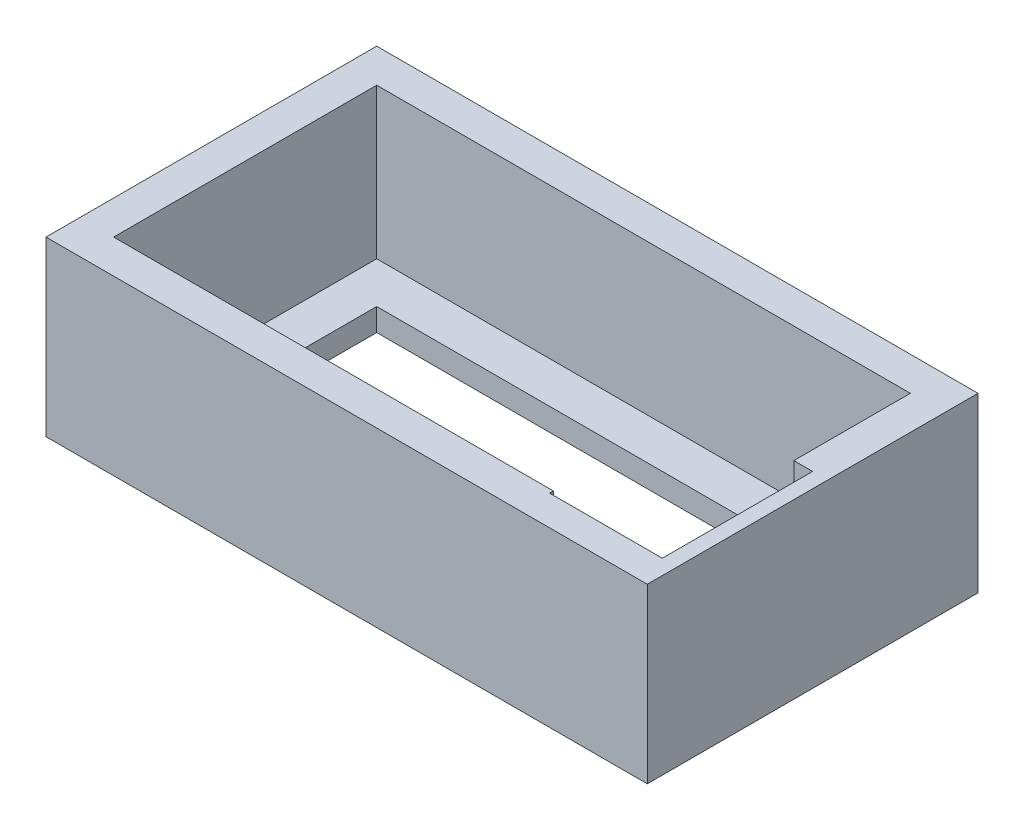
ISO-10303-21;
HEADER;
FILE_DESCRIPTION(('STEP AP214'),'2;1');
FILE_NAME('part.step','',(''),(''),'','','');
FILE_SCHEMA(('AUTOMOTIVE_DESIGN { 1 0 10303 214 1 1 1 1 }'));
ENDSEC;
DATA;
#1=APPLICATION_CONTEXT('core data for automotive mechanical design processes');
#2=APPLICATION_PROTOCOL_DEFINITION('international standard','automotive_design',2000,#1);
#3=PRODUCT_CONTEXT('',#1,'mechanical');
#4=PRODUCT('Part','Part','',(#3));
#5=PRODUCT_RELATED_PRODUCT_CATEGORY('part','',(#4));
#6=PRODUCT_DEFINITION_FORMATION('','',#4);
#7=PRODUCT_DEFINITION_CONTEXT('part definition',#1,'design');
#8=PRODUCT_DEFINITION('design','',#6,#7);
#9=PRODUCT_DEFINITION_SHAPE('','',#8);
#10=(LENGTH_UNIT() NAMED_UNIT(*) SI_UNIT(.MILLI.,.METRE.));
#11=(NAMED_UNIT(*) PLANE_ANGLE_UNIT() SI_UNIT($,.RADIAN.));
#12=(NAMED_UNIT(*) SI_UNIT($,.STERADIAN.) SOLID_ANGLE_UNIT());
#13=UNCERTAINTY_MEASURE_WITH_UNIT(LENGTH_MEASURE(1.E-05),#10,'distance_accuracy_value','');
#14=(GEOMETRIC_REPRESENTATION_CONTEXT(3) GLOBAL_UNCERTAINTY_ASSIGNED_CONTEXT((#13)) GLOBAL_UNIT_ASSIGNED_CONTEXT((#10,
#11,#12)) REPRESENTATION_CONTEXT('',''));
#15=CARTESIAN_POINT('',(0.,0.,0.));
#16=DIRECTION('',(0.,0.,1.));
#17=DIRECTION('',(1.,0.,0.));
#18=AXIS2_PLACEMENT_3D('',#15,#16,#17);
#19=CARTESIAN_POINT('',(0.,3.,0.));
#20=DIRECTION('',(0.,-1.,0.));
#21=DIRECTION('',(0.,0.,-1.));
#22=AXIS2_PLACEMENT_3D('',#19,#20,#21);
#23=PLANE('',#22);
#24=DIRECTION('',(0.,0.,-1.));
#25=VECTOR('',#24,1.);
#26=CARTESIAN_POINT('',(30.,3.,12.));
#27=LINE('',#26,#25);
#28=CARTESIAN_POINT('',(30.,3.,-2.));
#29=VERTEX_POINT('',#28);
#30=CARTESIAN_POINT('',(30.,3.,-12.));
#31=VERTEX_POINT('',#30);
#32=EDGE_CURVE('E56',#29,#31,#27,.T.);
#33=ORIENTED_EDGE('',*,*,#32,.F.);
#34=DIRECTION('',(-1.,0.,0.));
#35=VECTOR('',#34,1.);
#36=CARTESIAN_POINT('',(38.,3.,-2.));
#37=LINE('',#36,#35);
#38=CARTESIAN_POINT('',(35.5,3.,-2.));
#39=VERTEX_POINT('',#38);
#40=EDGE_CURVE('E175',#39,#29,#37,.T.);
#41=ORIENTED_EDGE('',*,*,#40,.F.);
#42=DIRECTION('',(0.,0.,-1.));
#43=VECTOR('',#42,1.);
#44=CARTESIAN_POINT('',(35.5,3.,17.5));
#45=LINE('',#44,#43);
#46=CARTESIAN_POINT('',(35.5,3.,-17.5));
#47=VERTEX_POINT('',#46);
#48=EDGE_CURVE('E195',#39,#47,#45,.T.);
#49=ORIENTED_EDGE('',*,*,#48,.T.);
#50=DIRECTION('',(-1.,0.,0.));
#51=VECTOR('',#50,1.);
#52=CARTESIAN_POINT('',(35.5,3.,-17.5));
#53=LINE('',#52,#51);
#54=CARTESIAN_POINT('',(-35.5,3.,-17.5));
#55=VERTEX_POINT('',#54);
#56=EDGE_CURVE('E209',#47,#55,#53,.T.);
#57=ORIENTED_EDGE('',*,*,#56,.T.);
#58=DIRECTION('',(0.,0.,1.));
#59=VECTOR('',#58,1.);
#60=CARTESIAN_POINT('',(-35.5,3.,-17.5));
#61=LINE('',#60,#59);
#62=CARTESIAN_POINT('',(-35.5,3.,17.5));
#63=VERTEX_POINT('',#62);
#64=EDGE_CURVE('E212',#55,#63,#61,.T.);
#65=ORIENTED_EDGE('',*,*,#64,.T.);
#66=DIRECTION('',(1.,0.,0.));
#67=VECTOR('',#66,1.);
#68=CARTESIAN_POINT('',(-35.5,3.,17.5));
#69=LINE('',#68,#67);
#70=CARTESIAN_POINT('',(23.,3.,17.5));
#71=VERTEX_POINT('',#70);
#72=EDGE_CURVE('E199',#63,#71,#69,.T.);
#73=ORIENTED_EDGE('',*,*,#72,.T.);
#74=DIRECTION('',(0.,0.,1.));
#75=VECTOR('',#74,1.);
#76=CARTESIAN_POINT('',(23.,3.,18.));
#77=LINE('',#76,#75);
#78=CARTESIAN_POINT('',(23.,3.,12.));
#79=VERTEX_POINT('',#78);
#80=EDGE_CURVE('E48',#79,#71,#77,.T.);
#81=ORIENTED_EDGE('',*,*,#80,.F.);
#82=DIRECTION('',(1.,0.,0.));
#83=VECTOR('',#82,1.);
#84=CARTESIAN_POINT('',(-30.,3.,12.));
#85=LINE('',#84,#83);
#86=CARTESIAN_POINT('',(-30.,3.,12.));
#87=VERTEX_POINT('',#86);
#88=EDGE_CURVE('E238',#87,#79,#85,.T.);
#89=ORIENTED_EDGE('',*,*,#88,.F.);
#90=DIRECTION('',(0.,0.,1.));
#91=VECTOR('',#90,1.);
#92=CARTESIAN_POINT('',(-30.,3.,12.));
#93=LINE('',#92,#91);
#94=CARTESIAN_POINT('',(-30.,3.,-12.));
#95=VERTEX_POINT('',#94);
#96=EDGE_CURVE('E236',#95,#87,#93,.T.);
#97=ORIENTED_EDGE('',*,*,#96,.F.);
#98=DIRECTION('',(-1.,0.,0.));
#99=VECTOR('',#98,1.);
#100=CARTESIAN_POINT('',(-30.,3.,-12.));
#101=LINE('',#100,#99);
#102=EDGE_CURVE('E243',#31,#95,#101,.T.);
#103=ORIENTED_EDGE('',*,*,#102,.F.);
#104=EDGE_LOOP('',(#33,#41,#49,#57,#65,#73,#81,#89,#97,#103));
#105=FACE_BOUND('',#104,.T.);
#106=ADVANCED_FACE('F33',(#105),#23,.F.);
#107=CARTESIAN_POINT('',(0.,0.,0.));
#108=DIRECTION('',(0.,-1.,0.));
#109=DIRECTION('',(0.,0.,-1.));
#110=AXIS2_PLACEMENT_3D('',#107,#108,#109);
#111=PLANE('',#110);
#112=DIRECTION('',(1.,0.,0.));
#113=VECTOR('',#112,1.);
#114=CARTESIAN_POINT('',(38.,0.,-2.));
#115=LINE('',#114,#113);
#116=CARTESIAN_POINT('',(30.,0.,-2.));
#117=VERTEX_POINT('',#116);
#118=CARTESIAN_POINT('',(38.,0.,-2.));
#119=VERTEX_POINT('',#118);
#120=EDGE_CURVE('E166',#117,#119,#115,.T.);
#121=ORIENTED_EDGE('',*,*,#120,.F.);
#122=DIRECTION('',(0.,0.,-1.));
#123=VECTOR('',#122,1.);
#124=CARTESIAN_POINT('',(30.,0.,12.));
#125=LINE('',#124,#123);
#126=CARTESIAN_POINT('',(30.,0.,-12.));
#127=VERTEX_POINT('',#126);
#128=EDGE_CURVE('E250',#117,#127,#125,.T.);
#129=ORIENTED_EDGE('',*,*,#128,.T.);
#130=DIRECTION('',(-1.,0.,0.));
#131=VECTOR('',#130,1.);
#132=CARTESIAN_POINT('',(-30.,0.,-12.));
#133=LINE('',#132,#131);
#134=CARTESIAN_POINT('',(-30.,0.,-12.));
#135=VERTEX_POINT('',#134);
#136=EDGE_CURVE('E239',#127,#135,#133,.T.);
#137=ORIENTED_EDGE('',*,*,#136,.T.);
#138=DIRECTION('',(0.,0.,1.));
#139=VECTOR('',#138,1.);
#140=CARTESIAN_POINT('',(-30.,0.,12.));
#141=LINE('',#140,#139);
#142=CARTESIAN_POINT('',(-30.,0.,12.));
#143=VERTEX_POINT('',#142);
#144=EDGE_CURVE('E235',#135,#143,#141,.T.);
#145=ORIENTED_EDGE('',*,*,#144,.T.);
#146=DIRECTION('',(1.,0.,0.));
#147=VECTOR('',#146,1.);
#148=CARTESIAN_POINT('',(-30.,0.,12.));
#149=LINE('',#148,#147);
#150=CARTESIAN_POINT('',(23.,0.,12.));
#151=VERTEX_POINT('',#150);
#152=EDGE_CURVE('E248',#143,#151,#149,.T.);
#153=ORIENTED_EDGE('',*,*,#152,.T.);
#154=DIRECTION('',(0.,0.,-1.));
#155=VECTOR('',#154,1.);
#156=CARTESIAN_POINT('',(23.,0.,18.));
#157=LINE('',#156,#155);
#158=CARTESIAN_POINT('',(23.,0.,18.));
#159=VERTEX_POINT('',#158);
#160=EDGE_CURVE('E180',#159,#151,#157,.T.);
#161=ORIENTED_EDGE('',*,*,#160,.F.);
#162=DIRECTION('',(-1.,0.,0.));
#163=VECTOR('',#162,1.);
#164=CARTESIAN_POINT('',(38.,0.,18.));
#165=LINE('',#164,#163);
#166=CARTESIAN_POINT('',(38.,0.,18.));
#167=VERTEX_POINT('',#166);
#168=EDGE_CURVE('E158',#167,#159,#165,.T.);
#169=ORIENTED_EDGE('',*,*,#168,.F.);
#170=DIRECTION('',(0.,0.,1.));
#171=VECTOR('',#170,1.);
#172=CARTESIAN_POINT('',(38.,0.,18.));
#173=LINE('',#172,#171);
#174=EDGE_CURVE('E169',#119,#167,#173,.T.);
#175=ORIENTED_EDGE('',*,*,#174,.F.);
#176=EDGE_LOOP('',(#121,#129,#137,#145,#153,#161,#169,#175));
#177=FACE_BOUND('',#176,.T.);
#178=DIRECTION('',(0.,0.,-1.));
#179=VECTOR('',#178,1.);
#180=CARTESIAN_POINT('',(40.,0.,22.));
#181=LINE('',#180,#179);
#182=CARTESIAN_POINT('',(40.,0.,22.));
#183=VERTEX_POINT('',#182);
#184=CARTESIAN_POINT('',(40.,0.,-22.));
#185=VERTEX_POINT('',#184);
#186=EDGE_CURVE('E261',#183,#185,#181,.T.);
#187=ORIENTED_EDGE('',*,*,#186,.F.);
#188=DIRECTION('',(1.,0.,0.));
#189=VECTOR('',#188,1.);
#190=CARTESIAN_POINT('',(-40.,0.,22.));
#191=LINE('',#190,#189);
#192=CARTESIAN_POINT('',(-40.,0.,22.));
#193=VERTEX_POINT('',#192);
#194=EDGE_CURVE('E268',#193,#183,#191,.T.);
#195=ORIENTED_EDGE('',*,*,#194,.F.);
#196=DIRECTION('',(0.,0.,1.));
#197=VECTOR('',#196,1.);
#198=CARTESIAN_POINT('',(-40.,0.,22.));
#199=LINE('',#198,#197);
#200=CARTESIAN_POINT('',(-40.,0.,-22.));
#201=VERTEX_POINT('',#200);
#202=EDGE_CURVE('E266',#201,#193,#199,.T.);
#203=ORIENTED_EDGE('',*,*,#202,.F.);
#204=DIRECTION('',(-1.,0.,0.));
#205=VECTOR('',#204,1.);
#206=CARTESIAN_POINT('',(-40.,0.,-22.));
#207=LINE('',#206,#205);
#208=EDGE_CURVE('E264',#185,#201,#207,.T.);
#209=ORIENTED_EDGE('',*,*,#208,.F.);
#210=EDGE_LOOP('',(#187,#195,#203,#209));
#211=FACE_BOUND('',#210,.T.);
#212=ADVANCED_FACE('F177',(#177,#211),#111,.T.);
#213=CARTESIAN_POINT('',(40.,3.,22.));
#214=DIRECTION('',(-1.,0.,0.));
#215=DIRECTION('',(0.,0.,1.));
#216=AXIS2_PLACEMENT_3D('',#213,#214,#215);
#217=PLANE('',#216);
#218=ORIENTED_EDGE('',*,*,#186,.T.);
#219=DIRECTION('',(0.,-1.,0.));
#220=VECTOR('',#219,1.);
#221=CARTESIAN_POINT('',(40.,3.,-22.));
#222=LINE('',#221,#220);
#223=CARTESIAN_POINT('',(40.,23.,-22.));
#224=VERTEX_POINT('',#223);
#225=EDGE_CURVE('E11',#224,#185,#222,.T.);
#226=ORIENTED_EDGE('',*,*,#225,.F.);
#227=DIRECTION('',(0.,0.,-1.));
#228=VECTOR('',#227,1.);
#229=CARTESIAN_POINT('',(40.,23.,22.));
#230=LINE('',#229,#228);
#231=CARTESIAN_POINT('',(40.,23.,22.));
#232=VERTEX_POINT('',#231);
#233=EDGE_CURVE('E232',#232,#224,#230,.T.);
#234=ORIENTED_EDGE('',*,*,#233,.F.);
#235=DIRECTION('',(0.,-1.,0.));
#236=VECTOR('',#235,1.);
#237=CARTESIAN_POINT('',(40.,3.,22.));
#238=LINE('',#237,#236);
#239=EDGE_CURVE('E270',#232,#183,#238,.T.);
#240=ORIENTED_EDGE('',*,*,#239,.T.);
#241=EDGE_LOOP('',(#218,#226,#234,#240));
#242=FACE_BOUND('',#241,.T.);
#243=ADVANCED_FACE('F35',(#242),#217,.F.);
#244=CARTESIAN_POINT('',(-40.,3.,-22.));
#245=DIRECTION('',(0.,0.,1.));
#246=DIRECTION('',(1.,0.,0.));
#247=AXIS2_PLACEMENT_3D('',#244,#245,#246);
#248=PLANE('',#247);
#249=ORIENTED_EDGE('',*,*,#208,.T.);
#250=DIRECTION('',(0.,-1.,0.));
#251=VECTOR('',#250,1.);
#252=CARTESIAN_POINT('',(-40.,3.,-22.));
#253=LINE('',#252,#251);
#254=CARTESIAN_POINT('',(-40.,23.,-22.));
#255=VERTEX_POINT('',#254);
#256=EDGE_CURVE('E41',#255,#201,#253,.T.);
#257=ORIENTED_EDGE('',*,*,#256,.F.);
#258=DIRECTION('',(-1.,0.,0.));
#259=VECTOR('',#258,1.);
#260=CARTESIAN_POINT('',(40.,23.,-22.));
#261=LINE('',#260,#259);
#262=EDGE_CURVE('E223',#224,#255,#261,.T.);
#263=ORIENTED_EDGE('',*,*,#262,.F.);
#264=ORIENTED_EDGE('',*,*,#225,.T.);
#265=EDGE_LOOP('',(#249,#257,#263,#264));
#266=FACE_BOUND('',#265,.T.);
#267=ADVANCED_FACE('F291',(#266),#248,.F.);
#268=CARTESIAN_POINT('',(-40.,3.,22.));
#269=DIRECTION('',(1.,0.,0.));
#270=DIRECTION('',(0.,0.,-1.));
#271=AXIS2_PLACEMENT_3D('',#268,#269,#270);
#272=PLANE('',#271);
#273=ORIENTED_EDGE('',*,*,#202,.T.);
#274=DIRECTION('',(0.,-1.,0.));
#275=VECTOR('',#274,1.);
#276=CARTESIAN_POINT('',(-40.,3.,22.));
#277=LINE('',#276,#275);
#278=CARTESIAN_POINT('',(-40.,23.,22.));
#279=VERTEX_POINT('',#278);
#280=EDGE_CURVE('E273',#279,#193,#277,.T.);
#281=ORIENTED_EDGE('',*,*,#280,.F.);
#282=DIRECTION('',(0.,0.,1.));
#283=VECTOR('',#282,1.);
#284=CARTESIAN_POINT('',(-40.,23.,-22.));
#285=LINE('',#284,#283);
#286=EDGE_CURVE('E226',#255,#279,#285,.T.);
#287=ORIENTED_EDGE('',*,*,#286,.F.);
#288=ORIENTED_EDGE('',*,*,#256,.T.);
#289=EDGE_LOOP('',(#273,#281,#287,#288));
#290=FACE_BOUND('',#289,.T.);
#291=ADVANCED_FACE('F279',(#290),#272,.F.);
#292=CARTESIAN_POINT('',(-40.,3.,22.));
#293=DIRECTION('',(0.,0.,-1.));
#294=DIRECTION('',(-1.,0.,0.));
#295=AXIS2_PLACEMENT_3D('',#292,#293,#294);
#296=PLANE('',#295);
#297=ORIENTED_EDGE('',*,*,#194,.T.);
#298=ORIENTED_EDGE('',*,*,#239,.F.);
#299=DIRECTION('',(1.,0.,0.));
#300=VECTOR('',#299,1.);
#301=CARTESIAN_POINT('',(-40.,23.,22.));
#302=LINE('',#301,#300);
#303=EDGE_CURVE('E229',#279,#232,#302,.T.);
#304=ORIENTED_EDGE('',*,*,#303,.F.);
#305=ORIENTED_EDGE('',*,*,#280,.T.);
#306=EDGE_LOOP('',(#297,#298,#304,#305));
#307=FACE_BOUND('',#306,.T.);
#308=ADVANCED_FACE('F285',(#307),#296,.F.);
#309=CARTESIAN_POINT('',(-30.,3.,12.));
#310=DIRECTION('',(1.,0.,0.));
#311=DIRECTION('',(0.,0.,-1.));
#312=AXIS2_PLACEMENT_3D('',#309,#310,#311);
#313=PLANE('',#312);
#314=ORIENTED_EDGE('',*,*,#144,.F.);
#315=DIRECTION('',(0.,-1.,0.));
#316=VECTOR('',#315,1.);
#317=CARTESIAN_POINT('',(-30.,3.,-12.));
#318=LINE('',#317,#316);
#319=EDGE_CURVE('E245',#95,#135,#318,.T.);
#320=ORIENTED_EDGE('',*,*,#319,.F.);
#321=ORIENTED_EDGE('',*,*,#96,.T.);
#322=DIRECTION('',(0.,-1.,0.));
#323=VECTOR('',#322,1.);
#324=CARTESIAN_POINT('',(-30.,3.,12.));
#325=LINE('',#324,#323);
#326=EDGE_CURVE('E258',#87,#143,#325,.T.);
#327=ORIENTED_EDGE('',*,*,#326,.T.);
#328=EDGE_LOOP('',(#314,#320,#321,#327));
#329=FACE_BOUND('',#328,.T.);
#330=ADVANCED_FACE('F306',(#329),#313,.T.);
#331=CARTESIAN_POINT('',(-30.,3.,12.));
#332=DIRECTION('',(0.,0.,-1.));
#333=DIRECTION('',(-1.,0.,0.));
#334=AXIS2_PLACEMENT_3D('',#331,#332,#333);
#335=PLANE('',#334);
#336=DIRECTION('',(0.,-1.,0.));
#337=VECTOR('',#336,1.);
#338=CARTESIAN_POINT('',(23.,23.001,12.));
#339=LINE('',#338,#337);
#340=EDGE_CURVE('E331',#79,#151,#339,.T.);
#341=ORIENTED_EDGE('',*,*,#340,.T.);
#342=ORIENTED_EDGE('',*,*,#152,.F.);
#343=ORIENTED_EDGE('',*,*,#326,.F.);
#344=ORIENTED_EDGE('',*,*,#88,.T.);
#345=EDGE_LOOP('',(#341,#342,#343,#344));
#346=FACE_BOUND('',#345,.T.);
#347=ADVANCED_FACE('F313',(#346),#335,.T.);
#348=CARTESIAN_POINT('',(30.,3.,12.));
#349=DIRECTION('',(-1.,0.,0.));
#350=DIRECTION('',(0.,0.,1.));
#351=AXIS2_PLACEMENT_3D('',#348,#349,#350);
#352=PLANE('',#351);
#353=DIRECTION('',(0.,1.,0.));
#354=VECTOR('',#353,1.);
#355=CARTESIAN_POINT('',(30.,23.001,-2.));
#356=LINE('',#355,#354);
#357=EDGE_CURVE('E333',#117,#29,#356,.T.);
#358=ORIENTED_EDGE('',*,*,#357,.T.);
#359=ORIENTED_EDGE('',*,*,#32,.T.);
#360=DIRECTION('',(0.,-1.,0.));
#361=VECTOR('',#360,1.);
#362=CARTESIAN_POINT('',(30.,3.,-12.));
#363=LINE('',#362,#361);
#364=EDGE_CURVE('E256',#31,#127,#363,.T.);
#365=ORIENTED_EDGE('',*,*,#364,.T.);
#366=ORIENTED_EDGE('',*,*,#128,.F.);
#367=EDGE_LOOP('',(#358,#359,#365,#366));
#368=FACE_BOUND('',#367,.T.);
#369=ADVANCED_FACE('F318',(#368),#352,.T.);
#370=CARTESIAN_POINT('',(-30.,3.,-12.));
#371=DIRECTION('',(0.,0.,1.));
#372=DIRECTION('',(1.,0.,0.));
#373=AXIS2_PLACEMENT_3D('',#370,#371,#372);
#374=PLANE('',#373);
#375=ORIENTED_EDGE('',*,*,#136,.F.);
#376=ORIENTED_EDGE('',*,*,#364,.F.);
#377=ORIENTED_EDGE('',*,*,#102,.T.);
#378=ORIENTED_EDGE('',*,*,#319,.T.);
#379=EDGE_LOOP('',(#375,#376,#377,#378));
#380=FACE_BOUND('',#379,.T.);
#381=ADVANCED_FACE('F325',(#380),#374,.T.);
#382=CARTESIAN_POINT('',(0.,23.,0.));
#383=DIRECTION('',(0.,1.,0.));
#384=DIRECTION('',(0.,0.,1.));
#385=AXIS2_PLACEMENT_3D('',#382,#383,#384);
#386=PLANE('',#385);
#387=DIRECTION('',(1.,0.,0.));
#388=VECTOR('',#387,1.);
#389=CARTESIAN_POINT('',(38.,23.,-2.));
#390=LINE('',#389,#388);
#391=CARTESIAN_POINT('',(35.5,23.,-2.));
#392=VERTEX_POINT('',#391);
#393=CARTESIAN_POINT('',(38.,23.,-2.));
#394=VERTEX_POINT('',#393);
#395=EDGE_CURVE('E341',#392,#394,#390,.T.);
#396=ORIENTED_EDGE('',*,*,#395,.T.);
#397=DIRECTION('',(0.,0.,1.));
#398=VECTOR('',#397,1.);
#399=CARTESIAN_POINT('',(38.,23.,18.));
#400=LINE('',#399,#398);
#401=CARTESIAN_POINT('',(38.,23.,18.));
#402=VERTEX_POINT('',#401);
#403=EDGE_CURVE('E336',#394,#402,#400,.T.);
#404=ORIENTED_EDGE('',*,*,#403,.T.);
#405=DIRECTION('',(-1.,0.,0.));
#406=VECTOR('',#405,1.);
#407=CARTESIAN_POINT('',(38.,23.,18.));
#408=LINE('',#407,#406);
#409=CARTESIAN_POINT('',(23.,23.,18.));
#410=VERTEX_POINT('',#409);
#411=EDGE_CURVE('E161',#402,#410,#408,.T.);
#412=ORIENTED_EDGE('',*,*,#411,.T.);
#413=DIRECTION('',(0.,0.,-1.));
#414=VECTOR('',#413,1.);
#415=CARTESIAN_POINT('',(23.,23.,18.));
#416=LINE('',#415,#414);
#417=CARTESIAN_POINT('',(23.,23.,17.5));
#418=VERTEX_POINT('',#417);
#419=EDGE_CURVE('E332',#410,#418,#416,.T.);
#420=ORIENTED_EDGE('',*,*,#419,.T.);
#421=DIRECTION('',(1.,0.,0.));
#422=VECTOR('',#421,1.);
#423=CARTESIAN_POINT('',(-35.5,23.,17.5));
#424=LINE('',#423,#422);
#425=CARTESIAN_POINT('',(-35.5,23.,17.5));
#426=VERTEX_POINT('',#425);
#427=EDGE_CURVE('E204',#426,#418,#424,.T.);
#428=ORIENTED_EDGE('',*,*,#427,.F.);
#429=DIRECTION('',(0.,0.,1.));
#430=VECTOR('',#429,1.);
#431=CARTESIAN_POINT('',(-35.5,23.,-17.5));
#432=LINE('',#431,#430);
#433=CARTESIAN_POINT('',(-35.5,23.,-17.5));
#434=VERTEX_POINT('',#433);
#435=EDGE_CURVE('E201',#434,#426,#432,.T.);
#436=ORIENTED_EDGE('',*,*,#435,.F.);
#437=DIRECTION('',(-1.,0.,0.));
#438=VECTOR('',#437,1.);
#439=CARTESIAN_POINT('',(35.5,23.,-17.5));
#440=LINE('',#439,#438);
#441=CARTESIAN_POINT('',(35.5,23.,-17.5));
#442=VERTEX_POINT('',#441);
#443=EDGE_CURVE('E198',#442,#434,#440,.T.);
#444=ORIENTED_EDGE('',*,*,#443,.F.);
#445=DIRECTION('',(0.,0.,-1.));
#446=VECTOR('',#445,1.);
#447=CARTESIAN_POINT('',(35.5,23.,17.5));
#448=LINE('',#447,#446);
#449=EDGE_CURVE('E196',#392,#442,#448,.T.);
#450=ORIENTED_EDGE('',*,*,#449,.F.);
#451=EDGE_LOOP('',(#396,#404,#412,#420,#428,#436,#444,#450));
#452=FACE_BOUND('',#451,.T.);
#453=ORIENTED_EDGE('',*,*,#262,.T.);
#454=ORIENTED_EDGE('',*,*,#286,.T.);
#455=ORIENTED_EDGE('',*,*,#303,.T.);
#456=ORIENTED_EDGE('',*,*,#233,.T.);
#457=EDGE_LOOP('',(#453,#454,#455,#456));
#458=FACE_BOUND('',#457,.T.);
#459=ADVANCED_FACE('F290',(#452,#458),#386,.T.);
#460=CARTESIAN_POINT('',(35.5,23.,17.5));
#461=DIRECTION('',(-1.,0.,0.));
#462=DIRECTION('',(0.,0.,1.));
#463=AXIS2_PLACEMENT_3D('',#460,#461,#462);
#464=PLANE('',#463);
#465=DIRECTION('',(0.,1.,0.));
#466=VECTOR('',#465,1.);
#467=CARTESIAN_POINT('',(35.5,23.001,-2.));
#468=LINE('',#467,#466);
#469=EDGE_CURVE('E192',#39,#392,#468,.T.);
#470=ORIENTED_EDGE('',*,*,#469,.T.);
#471=ORIENTED_EDGE('',*,*,#449,.T.);
#472=DIRECTION('',(0.,-1.,0.));
#473=VECTOR('',#472,1.);
#474=CARTESIAN_POINT('',(35.5,23.,-17.5));
#475=LINE('',#474,#473);
#476=EDGE_CURVE('E220',#442,#47,#475,.T.);
#477=ORIENTED_EDGE('',*,*,#476,.T.);
#478=ORIENTED_EDGE('',*,*,#48,.F.);
#479=EDGE_LOOP('',(#470,#471,#477,#478));
#480=FACE_BOUND('',#479,.T.);
#481=ADVANCED_FACE('F348',(#480),#464,.T.);
#482=CARTESIAN_POINT('',(35.5,23.,-17.5));
#483=DIRECTION('',(0.,0.,1.));
#484=DIRECTION('',(1.,0.,0.));
#485=AXIS2_PLACEMENT_3D('',#482,#483,#484);
#486=PLANE('',#485);
#487=ORIENTED_EDGE('',*,*,#56,.F.);
#488=ORIENTED_EDGE('',*,*,#476,.F.);
#489=ORIENTED_EDGE('',*,*,#443,.T.);
#490=DIRECTION('',(0.,-1.,0.));
#491=VECTOR('',#490,1.);
#492=CARTESIAN_POINT('',(-35.5,23.,-17.5));
#493=LINE('',#492,#491);
#494=EDGE_CURVE('E218',#434,#55,#493,.T.);
#495=ORIENTED_EDGE('',*,*,#494,.T.);
#496=EDGE_LOOP('',(#487,#488,#489,#495));
#497=FACE_BOUND('',#496,.T.);
#498=ADVANCED_FACE('F353',(#497),#486,.T.);
#499=CARTESIAN_POINT('',(-35.5,23.,-17.5));
#500=DIRECTION('',(1.,0.,0.));
#501=DIRECTION('',(0.,0.,-1.));
#502=AXIS2_PLACEMENT_3D('',#499,#500,#501);
#503=PLANE('',#502);
#504=ORIENTED_EDGE('',*,*,#64,.F.);
#505=ORIENTED_EDGE('',*,*,#494,.F.);
#506=ORIENTED_EDGE('',*,*,#435,.T.);
#507=DIRECTION('',(0.,-1.,0.));
#508=VECTOR('',#507,1.);
#509=CARTESIAN_POINT('',(-35.5,23.,17.5));
#510=LINE('',#509,#508);
#511=EDGE_CURVE('E207',#426,#63,#510,.T.);
#512=ORIENTED_EDGE('',*,*,#511,.T.);
#513=EDGE_LOOP('',(#504,#505,#506,#512));
#514=FACE_BOUND('',#513,.T.);
#515=ADVANCED_FACE('F360',(#514),#503,.T.);
#516=CARTESIAN_POINT('',(-35.5,23.,17.5));
#517=DIRECTION('',(0.,0.,-1.));
#518=DIRECTION('',(-1.,0.,0.));
#519=AXIS2_PLACEMENT_3D('',#516,#517,#518);
#520=PLANE('',#519);
#521=DIRECTION('',(0.,-1.,0.));
#522=VECTOR('',#521,1.);
#523=CARTESIAN_POINT('',(23.,23.001,17.5));
#524=LINE('',#523,#522);
#525=EDGE_CURVE('E189',#418,#71,#524,.T.);
#526=ORIENTED_EDGE('',*,*,#525,.T.);
#527=ORIENTED_EDGE('',*,*,#72,.F.);
#528=ORIENTED_EDGE('',*,*,#511,.F.);
#529=ORIENTED_EDGE('',*,*,#427,.T.);
#530=EDGE_LOOP('',(#526,#527,#528,#529));
#531=FACE_BOUND('',#530,.T.);
#532=ADVANCED_FACE('F363',(#531),#520,.T.);
#533=CARTESIAN_POINT('',(38.,23.001,18.));
#534=DIRECTION('',(1.,0.,0.));
#535=DIRECTION('',(0.,0.,-1.));
#536=AXIS2_PLACEMENT_3D('',#533,#534,#535);
#537=PLANE('',#536);
#538=DIRECTION('',(0.,-1.,0.));
#539=VECTOR('',#538,1.);
#540=CARTESIAN_POINT('',(38.,23.001,-2.));
#541=LINE('',#540,#539);
#542=EDGE_CURVE('E171',#394,#119,#541,.T.);
#543=ORIENTED_EDGE('',*,*,#542,.T.);
#544=ORIENTED_EDGE('',*,*,#174,.T.);
#545=DIRECTION('',(0.,-1.,0.));
#546=VECTOR('',#545,1.);
#547=CARTESIAN_POINT('',(38.,23.001,18.));
#548=LINE('',#547,#546);
#549=EDGE_CURVE('E154',#402,#167,#548,.T.);
#550=ORIENTED_EDGE('',*,*,#549,.F.);
#551=ORIENTED_EDGE('',*,*,#403,.F.);
#552=EDGE_LOOP('',(#543,#544,#550,#551));
#553=FACE_BOUND('',#552,.T.);
#554=ADVANCED_FACE('F170',(#553),#537,.F.);
#555=CARTESIAN_POINT('',(38.,23.001,-2.));
#556=DIRECTION('',(0.,0.,-1.));
#557=DIRECTION('',(-1.,0.,0.));
#558=AXIS2_PLACEMENT_3D('',#555,#556,#557);
#559=PLANE('',#558);
#560=ORIENTED_EDGE('',*,*,#120,.T.);
#561=ORIENTED_EDGE('',*,*,#542,.F.);
#562=ORIENTED_EDGE('',*,*,#395,.F.);
#563=ORIENTED_EDGE('',*,*,#469,.F.);
#564=ORIENTED_EDGE('',*,*,#40,.T.);
#565=ORIENTED_EDGE('',*,*,#357,.F.);
#566=EDGE_LOOP('',(#560,#561,#562,#563,#564,#565));
#567=FACE_BOUND('',#566,.T.);
#568=ADVANCED_FACE('F344',(#567),#559,.F.);
#569=CARTESIAN_POINT('',(23.,23.001,18.));
#570=DIRECTION('',(-1.,0.,0.));
#571=DIRECTION('',(0.,0.,1.));
#572=AXIS2_PLACEMENT_3D('',#569,#570,#571);
#573=PLANE('',#572);
#574=ORIENTED_EDGE('',*,*,#80,.T.);
#575=ORIENTED_EDGE('',*,*,#525,.F.);
#576=ORIENTED_EDGE('',*,*,#419,.F.);
#577=DIRECTION('',(0.,-1.,0.));
#578=VECTOR('',#577,1.);
#579=CARTESIAN_POINT('',(23.,23.001,18.));
#580=LINE('',#579,#578);
#581=EDGE_CURVE('E165',#410,#159,#580,.T.);
#582=ORIENTED_EDGE('',*,*,#581,.T.);
#583=ORIENTED_EDGE('',*,*,#160,.T.);
#584=ORIENTED_EDGE('',*,*,#340,.F.);
#585=EDGE_LOOP('',(#574,#575,#576,#582,#583,#584));
#586=FACE_BOUND('',#585,.T.);
#587=ADVANCED_FACE('F365',(#586),#573,.F.);
#588=CARTESIAN_POINT('',(38.,23.001,18.));
#589=DIRECTION('',(0.,0.,1.));
#590=DIRECTION('',(1.,0.,0.));
#591=AXIS2_PLACEMENT_3D('',#588,#589,#590);
#592=PLANE('',#591);
#593=ORIENTED_EDGE('',*,*,#549,.T.);
#594=ORIENTED_EDGE('',*,*,#168,.T.);
#595=ORIENTED_EDGE('',*,*,#581,.F.);
#596=ORIENTED_EDGE('',*,*,#411,.F.);
#597=EDGE_LOOP('',(#593,#594,#595,#596));
#598=FACE_BOUND('',#597,.T.);
#599=ADVANCED_FACE('F156',(#598),#592,.F.);
#600=CLOSED_SHELL('',(#106,#212,#243,#267,#291,#308,#330,#347,#369,#381,#459,#481,#498,#515,
#532,#554,#568,#587,#599));
#601=MANIFOLD_SOLID_BREP('B2',#600);
#602=ADVANCED_BREP_SHAPE_REPRESENTATION('',(#18,#601),#14);
#603=SHAPE_DEFINITION_REPRESENTATION(#9,#602);
ENDSEC;
END-ISO-10303-21;
